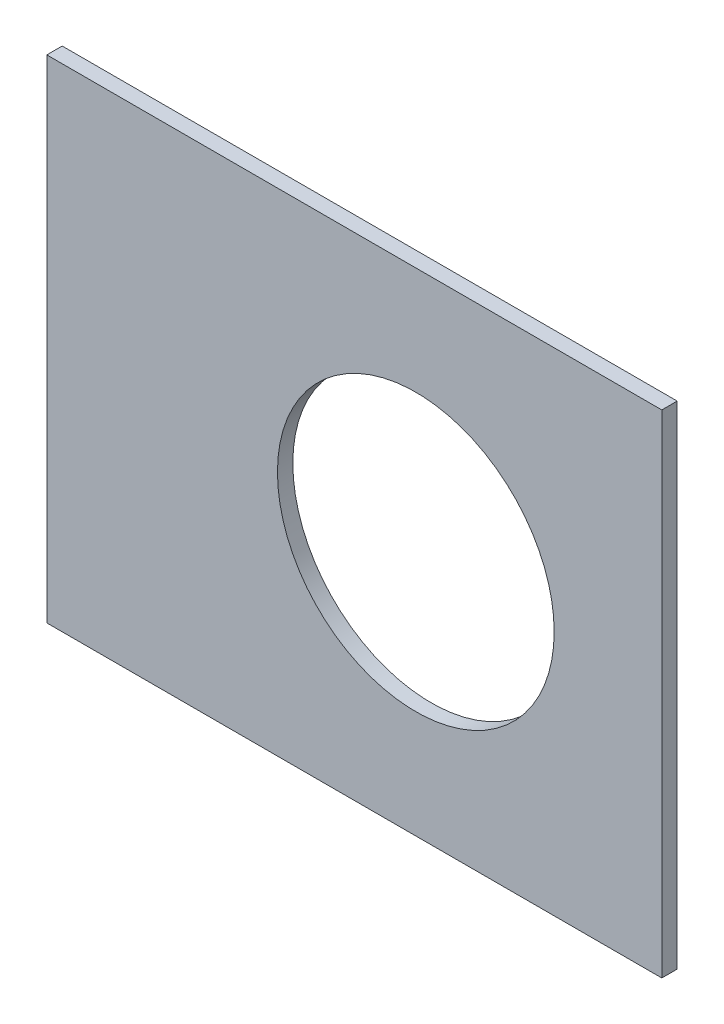
ISO-10303-21;
HEADER;
FILE_DESCRIPTION(('STEP AP214'),'2;1');
FILE_NAME('part.step','',(''),(''),'','','');
FILE_SCHEMA(('AUTOMOTIVE_DESIGN { 1 0 10303 214 1 1 1 1 }'));
ENDSEC;
DATA;
#1=APPLICATION_CONTEXT('core data for automotive mechanical design processes');
#2=APPLICATION_PROTOCOL_DEFINITION('international standard','automotive_design',2000,#1);
#3=PRODUCT_CONTEXT('',#1,'mechanical');
#4=PRODUCT('Part','Part','',(#3));
#5=PRODUCT_RELATED_PRODUCT_CATEGORY('part','',(#4));
#6=PRODUCT_DEFINITION_FORMATION('','',#4);
#7=PRODUCT_DEFINITION_CONTEXT('part definition',#1,'design');
#8=PRODUCT_DEFINITION('design','',#6,#7);
#9=PRODUCT_DEFINITION_SHAPE('','',#8);
#10=(LENGTH_UNIT() NAMED_UNIT(*) SI_UNIT(.MILLI.,.METRE.));
#11=(NAMED_UNIT(*) PLANE_ANGLE_UNIT() SI_UNIT($,.RADIAN.));
#12=(NAMED_UNIT(*) SI_UNIT($,.STERADIAN.) SOLID_ANGLE_UNIT());
#13=UNCERTAINTY_MEASURE_WITH_UNIT(LENGTH_MEASURE(1.E-05),#10,'distance_accuracy_value','');
#14=(GEOMETRIC_REPRESENTATION_CONTEXT(3) GLOBAL_UNCERTAINTY_ASSIGNED_CONTEXT((#13)) GLOBAL_UNIT_ASSIGNED_CONTEXT((#10,
#11,#12)) REPRESENTATION_CONTEXT('',''));
#15=CARTESIAN_POINT('',(0.,0.,0.));
#16=DIRECTION('',(0.,0.,1.));
#17=DIRECTION('',(1.,0.,0.));
#18=AXIS2_PLACEMENT_3D('',#15,#16,#17);
#19=CARTESIAN_POINT('',(0.,0.,5.));
#20=DIRECTION('',(0.,0.,-1.));
#21=DIRECTION('',(-1.,0.,0.));
#22=AXIS2_PLACEMENT_3D('',#19,#20,#21);
#23=PLANE('',#22);
#24=DIRECTION('',(0.,-1.,0.));
#25=VECTOR('',#24,1.);
#26=CARTESIAN_POINT('',(0.,0.,5.));
#27=LINE('',#26,#25);
#28=CARTESIAN_POINT('',(0.,160.,5.));
#29=VERTEX_POINT('',#28);
#30=CARTESIAN_POINT('',(0.,0.,5.));
#31=VERTEX_POINT('',#30);
#32=EDGE_CURVE('E86',#29,#31,#27,.T.);
#33=ORIENTED_EDGE('',*,*,#32,.T.);
#34=DIRECTION('',(1.,0.,0.));
#35=VECTOR('',#34,1.);
#36=CARTESIAN_POINT('',(0.,0.,5.));
#37=LINE('',#36,#35);
#38=CARTESIAN_POINT('',(200.,0.,5.));
#39=VERTEX_POINT('',#38);
#40=EDGE_CURVE('E81',#31,#39,#37,.T.);
#41=ORIENTED_EDGE('',*,*,#40,.T.);
#42=DIRECTION('',(0.,1.,0.));
#43=VECTOR('',#42,1.);
#44=CARTESIAN_POINT('',(200.,0.,5.));
#45=LINE('',#44,#43);
#46=CARTESIAN_POINT('',(200.,160.,5.));
#47=VERTEX_POINT('',#46);
#48=EDGE_CURVE('E84',#39,#47,#45,.T.);
#49=ORIENTED_EDGE('',*,*,#48,.T.);
#50=DIRECTION('',(-1.,0.,0.));
#51=VECTOR('',#50,1.);
#52=CARTESIAN_POINT('',(0.,160.,5.));
#53=LINE('',#52,#51);
#54=EDGE_CURVE('E51',#47,#29,#53,.T.);
#55=ORIENTED_EDGE('',*,*,#54,.T.);
#56=EDGE_LOOP('',(#33,#41,#49,#55));
#57=FACE_BOUND('',#56,.T.);
#58=CARTESIAN_POINT('',(120.,80.,5.));
#59=DIRECTION('',(0.,0.,1.));
#60=DIRECTION('',(1.,0.,0.));
#61=AXIS2_PLACEMENT_3D('',#58,#59,#60);
#62=CIRCLE('',#61,45.);
#63=CARTESIAN_POINT('',(165.,80.,5.));
#64=VERTEX_POINT('',#63);
#65=EDGE_CURVE('E101',#64,#64,#62,.T.);
#66=ORIENTED_EDGE('',*,*,#65,.F.);
#67=EDGE_LOOP('',(#66));
#68=FACE_BOUND('',#67,.T.);
#69=ADVANCED_FACE('F34',(#57,#68),#23,.F.);
#70=CARTESIAN_POINT('',(0.,0.,0.));
#71=DIRECTION('',(0.,0.,-1.));
#72=DIRECTION('',(-1.,0.,0.));
#73=AXIS2_PLACEMENT_3D('',#70,#71,#72);
#74=PLANE('',#73);
#75=DIRECTION('',(0.,-1.,0.));
#76=VECTOR('',#75,1.);
#77=CARTESIAN_POINT('',(0.,0.,0.));
#78=LINE('',#77,#76);
#79=CARTESIAN_POINT('',(0.,160.,0.));
#80=VERTEX_POINT('',#79);
#81=CARTESIAN_POINT('',(0.,0.,0.));
#82=VERTEX_POINT('',#81);
#83=EDGE_CURVE('E98',#80,#82,#78,.T.);
#84=ORIENTED_EDGE('',*,*,#83,.F.);
#85=DIRECTION('',(-1.,0.,0.));
#86=VECTOR('',#85,1.);
#87=CARTESIAN_POINT('',(0.,160.,0.));
#88=LINE('',#87,#86);
#89=CARTESIAN_POINT('',(200.,160.,0.));
#90=VERTEX_POINT('',#89);
#91=EDGE_CURVE('E74',#90,#80,#88,.T.);
#92=ORIENTED_EDGE('',*,*,#91,.F.);
#93=DIRECTION('',(0.,1.,0.));
#94=VECTOR('',#93,1.);
#95=CARTESIAN_POINT('',(200.,0.,0.));
#96=LINE('',#95,#94);
#97=CARTESIAN_POINT('',(200.,0.,0.));
#98=VERTEX_POINT('',#97);
#99=EDGE_CURVE('E68',#98,#90,#96,.T.);
#100=ORIENTED_EDGE('',*,*,#99,.F.);
#101=DIRECTION('',(1.,0.,0.));
#102=VECTOR('',#101,1.);
#103=CARTESIAN_POINT('',(0.,0.,0.));
#104=LINE('',#103,#102);
#105=EDGE_CURVE('E90',#82,#98,#104,.T.);
#106=ORIENTED_EDGE('',*,*,#105,.F.);
#107=EDGE_LOOP('',(#84,#92,#100,#106));
#108=FACE_BOUND('',#107,.T.);
#109=CARTESIAN_POINT('',(120.,80.,0.));
#110=DIRECTION('',(0.,0.,1.));
#111=DIRECTION('',(1.,0.,0.));
#112=AXIS2_PLACEMENT_3D('',#109,#110,#111);
#113=CIRCLE('',#112,45.);
#114=CARTESIAN_POINT('',(165.,80.,0.));
#115=VERTEX_POINT('',#114);
#116=EDGE_CURVE('E113',#115,#115,#113,.T.);
#117=ORIENTED_EDGE('',*,*,#116,.T.);
#118=EDGE_LOOP('',(#117));
#119=FACE_BOUND('',#118,.T.);
#120=ADVANCED_FACE('F109',(#108,#119),#74,.T.);
#121=CARTESIAN_POINT('',(0.,0.,5.));
#122=DIRECTION('',(1.,0.,0.));
#123=DIRECTION('',(0.,0.,-1.));
#124=AXIS2_PLACEMENT_3D('',#121,#122,#123);
#125=PLANE('',#124);
#126=ORIENTED_EDGE('',*,*,#83,.T.);
#127=DIRECTION('',(0.,0.,-1.));
#128=VECTOR('',#127,1.);
#129=CARTESIAN_POINT('',(0.,0.,5.));
#130=LINE('',#129,#128);
#131=EDGE_CURVE('E11',#31,#82,#130,.T.);
#132=ORIENTED_EDGE('',*,*,#131,.F.);
#133=ORIENTED_EDGE('',*,*,#32,.F.);
#134=DIRECTION('',(0.,0.,-1.));
#135=VECTOR('',#134,1.);
#136=CARTESIAN_POINT('',(0.,160.,5.));
#137=LINE('',#136,#135);
#138=EDGE_CURVE('E94',#29,#80,#137,.T.);
#139=ORIENTED_EDGE('',*,*,#138,.T.);
#140=EDGE_LOOP('',(#126,#132,#133,#139));
#141=FACE_BOUND('',#140,.T.);
#142=ADVANCED_FACE('F36',(#141),#125,.F.);
#143=CARTESIAN_POINT('',(0.,0.,5.));
#144=DIRECTION('',(0.,1.,0.));
#145=DIRECTION('',(0.,0.,1.));
#146=AXIS2_PLACEMENT_3D('',#143,#144,#145);
#147=PLANE('',#146);
#148=ORIENTED_EDGE('',*,*,#105,.T.);
#149=DIRECTION('',(0.,0.,-1.));
#150=VECTOR('',#149,1.);
#151=CARTESIAN_POINT('',(200.,0.,5.));
#152=LINE('',#151,#150);
#153=EDGE_CURVE('E43',#39,#98,#152,.T.);
#154=ORIENTED_EDGE('',*,*,#153,.F.);
#155=ORIENTED_EDGE('',*,*,#40,.F.);
#156=ORIENTED_EDGE('',*,*,#131,.T.);
#157=EDGE_LOOP('',(#148,#154,#155,#156));
#158=FACE_BOUND('',#157,.T.);
#159=ADVANCED_FACE('F89',(#158),#147,.F.);
#160=CARTESIAN_POINT('',(200.,0.,5.));
#161=DIRECTION('',(-1.,0.,0.));
#162=DIRECTION('',(0.,0.,1.));
#163=AXIS2_PLACEMENT_3D('',#160,#161,#162);
#164=PLANE('',#163);
#165=ORIENTED_EDGE('',*,*,#99,.T.);
#166=DIRECTION('',(0.,0.,-1.));
#167=VECTOR('',#166,1.);
#168=CARTESIAN_POINT('',(200.,160.,5.));
#169=LINE('',#168,#167);
#170=EDGE_CURVE('E91',#47,#90,#169,.T.);
#171=ORIENTED_EDGE('',*,*,#170,.F.);
#172=ORIENTED_EDGE('',*,*,#48,.F.);
#173=ORIENTED_EDGE('',*,*,#153,.T.);
#174=EDGE_LOOP('',(#165,#171,#172,#173));
#175=FACE_BOUND('',#174,.T.);
#176=ADVANCED_FACE('F92',(#175),#164,.F.);
#177=CARTESIAN_POINT('',(0.,160.,5.));
#178=DIRECTION('',(0.,-1.,0.));
#179=DIRECTION('',(0.,0.,-1.));
#180=AXIS2_PLACEMENT_3D('',#177,#178,#179);
#181=PLANE('',#180);
#182=ORIENTED_EDGE('',*,*,#91,.T.);
#183=ORIENTED_EDGE('',*,*,#138,.F.);
#184=ORIENTED_EDGE('',*,*,#54,.F.);
#185=ORIENTED_EDGE('',*,*,#170,.T.);
#186=EDGE_LOOP('',(#182,#183,#184,#185));
#187=FACE_BOUND('',#186,.T.);
#188=ADVANCED_FACE('F106',(#187),#181,.F.);
#189=CARTESIAN_POINT('',(120.,80.,5.));
#190=DIRECTION('',(0.,0.,-1.));
#191=DIRECTION('',(-1.,0.,0.));
#192=AXIS2_PLACEMENT_3D('',#189,#190,#191);
#193=CYLINDRICAL_SURFACE('',#192,45.);
#194=ORIENTED_EDGE('',*,*,#65,.T.);
#195=EDGE_LOOP('',(#194));
#196=FACE_BOUND('',#195,.T.);
#197=ORIENTED_EDGE('',*,*,#116,.F.);
#198=EDGE_LOOP('',(#197));
#199=FACE_BOUND('',#198,.T.);
#200=ADVANCED_FACE('F119',(#196,#199),#193,.F.);
#201=CLOSED_SHELL('',(#69,#120,#142,#159,#176,#188,#200));
#202=MANIFOLD_SOLID_BREP('B2',#201);
#203=ADVANCED_BREP_SHAPE_REPRESENTATION('',(#18,#202),#14);
#204=SHAPE_DEFINITION_REPRESENTATION(#9,#203);
ENDSEC;
END-ISO-10303-21;
